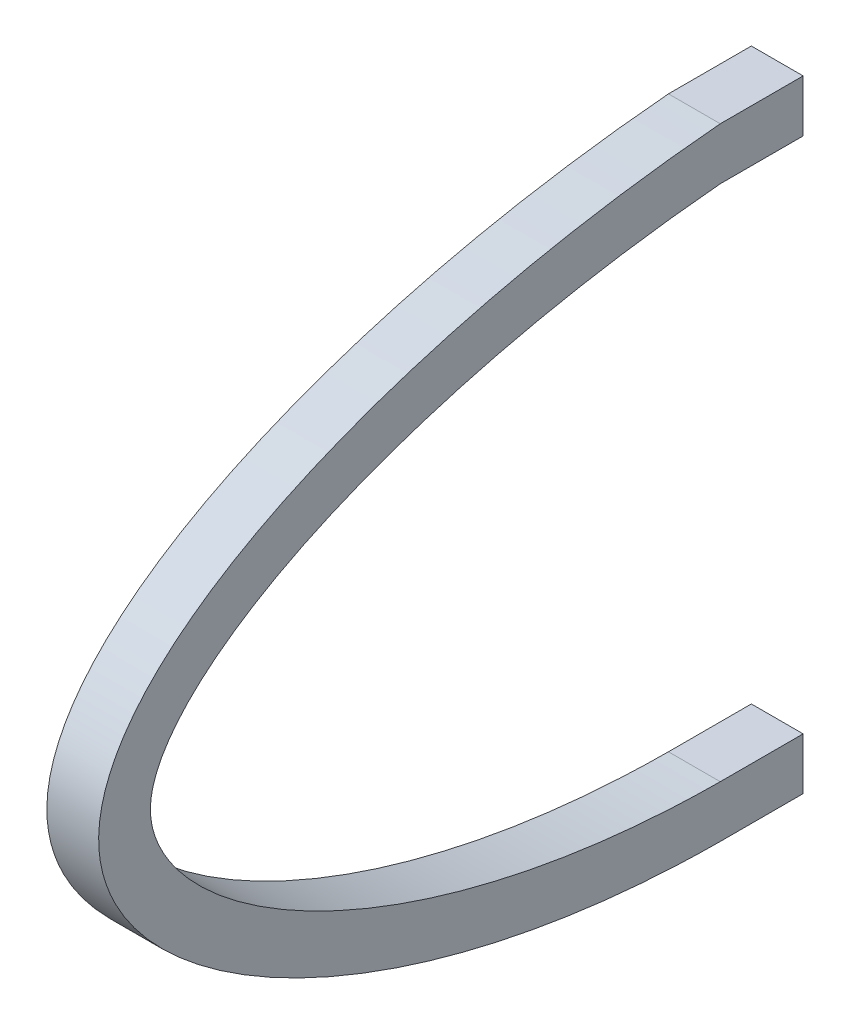
ISO-10303-21;
HEADER;
FILE_DESCRIPTION(('STEP AP214'),'2;1');
FILE_NAME('part.step','',(''),(''),'','','');
FILE_SCHEMA(('AUTOMOTIVE_DESIGN { 1 0 10303 214 1 1 1 1 }'));
ENDSEC;
DATA;
#1=APPLICATION_CONTEXT('core data for automotive mechanical design processes');
#2=APPLICATION_PROTOCOL_DEFINITION('international standard','automotive_design',2000,#1);
#3=PRODUCT_CONTEXT('',#1,'mechanical');
#4=PRODUCT('Part','Part','',(#3));
#5=PRODUCT_RELATED_PRODUCT_CATEGORY('part','',(#4));
#6=PRODUCT_DEFINITION_FORMATION('','',#4);
#7=PRODUCT_DEFINITION_CONTEXT('part definition',#1,'design');
#8=PRODUCT_DEFINITION('design','',#6,#7);
#9=PRODUCT_DEFINITION_SHAPE('','',#8);
#10=(LENGTH_UNIT() NAMED_UNIT(*) SI_UNIT(.MILLI.,.METRE.));
#11=(NAMED_UNIT(*) PLANE_ANGLE_UNIT() SI_UNIT($,.RADIAN.));
#12=(NAMED_UNIT(*) SI_UNIT($,.STERADIAN.) SOLID_ANGLE_UNIT());
#13=UNCERTAINTY_MEASURE_WITH_UNIT(LENGTH_MEASURE(1.E-05),#10,'distance_accuracy_value','');
#14=(GEOMETRIC_REPRESENTATION_CONTEXT(3) GLOBAL_UNCERTAINTY_ASSIGNED_CONTEXT((#13)) GLOBAL_UNIT_ASSIGNED_CONTEXT((#10,
#11,#12)) REPRESENTATION_CONTEXT('',''));
#15=CARTESIAN_POINT('',(0.,0.,0.));
#16=DIRECTION('',(0.,0.,1.));
#17=DIRECTION('',(1.,0.,0.));
#18=AXIS2_PLACEMENT_3D('',#15,#16,#17);
#19=CARTESIAN_POINT('',(2.5,25.0289491542641,-0.436628824984402));
#20=CARTESIAN_POINT('',(2.5,24.9395700058259,0.582975217120961));
#21=CARTESIAN_POINT('',(2.5,24.7401700683265,2.63045505060355));
#22=CARTESIAN_POINT('',(2.5,24.2711193834267,6.63746503717986));
#23=CARTESIAN_POINT('',(2.5,23.552462654983,11.5253834597104));
#24=CARTESIAN_POINT('',(2.5,22.4931304621103,17.1505259700721));
#25=CARTESIAN_POINT('',(2.5,20.8362155902983,24.295280126556));
#26=CARTESIAN_POINT('',(2.5,18.3430780360653,32.4795482876064));
#27=CARTESIAN_POINT('',(2.5,14.8061601457434,40.8506061792145));
#28=CARTESIAN_POINT('',(2.5,10.8932305459291,47.5011107796552));
#29=CARTESIAN_POINT('',(2.5,6.84602415373157,52.159077464287));
#30=CARTESIAN_POINT('',(2.5,3.7252925575514,54.2151887229658));
#31=CARTESIAN_POINT('',(2.5,1.5725893975115,54.9110090639514));
#32=CARTESIAN_POINT('',(2.5,0.096957705492859,55.0581045090311));
#33=CARTESIAN_POINT('',(2.5,-1.45615685938082,54.8607907140631));
#34=CARTESIAN_POINT('',(2.5,-3.83595966123072,54.0405785955811));
#35=CARTESIAN_POINT('',(2.5,-7.29991682469028,51.7657302320741));
#36=CARTESIAN_POINT('',(2.5,-11.7098894831255,46.9244741975008));
#37=CARTESIAN_POINT('',(2.5,-15.9144305174305,40.2077409332809));
#38=CARTESIAN_POINT('',(2.5,-19.6037231559487,31.8912051847254));
#39=CARTESIAN_POINT('',(2.5,-22.0398423531586,23.8584155214309));
#40=CARTESIAN_POINT('',(2.5,-23.4968241113966,16.9037726231752));
#41=CARTESIAN_POINT('',(2.5,-24.3181486771657,11.4570472951455));
#42=CARTESIAN_POINT('',(2.5,-24.7556535718619,6.74942214644306));
#43=CARTESIAN_POINT('',(2.5,-24.9453621982501,2.90512843317773));
#44=CARTESIAN_POINT('',(2.5,-24.9848703494899,0.947262235692928));
#45=CARTESIAN_POINT('',(2.5,-24.9902273107794,-0.0274784886774704));
#46=B_SPLINE_CURVE_WITH_KNOTS('',3,(#19,#20,#21,#22,#23,#24,#25,#26,#27,#28,#29,#30,#31,#32,#33,
#34,#35,#36,#37,#38,#39,#40,#41,#42,#43,#44,#45),.UNSPECIFIED.,.F.,.F.,(4,1,1,1,1,1,1,1,1,1,1,1,
1,1,1,1,1,1,1,1,1,1,1,1,4),(0.,0.015625,0.03125,0.0625,0.09375,0.125,0.1875,0.25,0.3125,0.375,
0.4375,0.46875,0.5,0.53125,0.5625,0.625,0.6875,0.75,0.8125,0.875,0.90625,0.9375,0.96875,
0.984375,1.),.UNSPECIFIED.);
#47=DIRECTION('',(-1.,0.,0.));
#48=VECTOR('',#47,1.);
#49=SURFACE_OF_LINEAR_EXTRUSION('',#46,#48);
#50=CARTESIAN_POINT('',(-2.5,25.0289491542641,-0.436628824984402));
#51=CARTESIAN_POINT('',(-2.5,24.9395700058259,0.582975217120961));
#52=CARTESIAN_POINT('',(-2.5,24.7401700683265,2.63045505060355));
#53=CARTESIAN_POINT('',(-2.5,24.2711193834267,6.63746503717986));
#54=CARTESIAN_POINT('',(-2.5,23.552462654983,11.5253834597104));
#55=CARTESIAN_POINT('',(-2.5,22.4931304621103,17.1505259700721));
#56=CARTESIAN_POINT('',(-2.5,20.8362155902983,24.295280126556));
#57=CARTESIAN_POINT('',(-2.5,18.3430780360653,32.4795482876064));
#58=CARTESIAN_POINT('',(-2.5,14.8061601457434,40.8506061792145));
#59=CARTESIAN_POINT('',(-2.5,10.8932305459291,47.5011107796552));
#60=CARTESIAN_POINT('',(-2.5,6.84602415373157,52.159077464287));
#61=CARTESIAN_POINT('',(-2.5,3.7252925575514,54.2151887229658));
#62=CARTESIAN_POINT('',(-2.5,1.5725893975115,54.9110090639514));
#63=CARTESIAN_POINT('',(-2.5,0.096957705492859,55.0581045090311));
#64=CARTESIAN_POINT('',(-2.5,-1.45615685938082,54.8607907140631));
#65=CARTESIAN_POINT('',(-2.5,-3.83595966123072,54.0405785955811));
#66=CARTESIAN_POINT('',(-2.5,-7.29991682469028,51.7657302320741));
#67=CARTESIAN_POINT('',(-2.5,-11.7098894831255,46.9244741975008));
#68=CARTESIAN_POINT('',(-2.5,-15.9144305174305,40.2077409332809));
#69=CARTESIAN_POINT('',(-2.5,-19.6037231559487,31.8912051847254));
#70=CARTESIAN_POINT('',(-2.5,-22.0398423531586,23.8584155214309));
#71=CARTESIAN_POINT('',(-2.5,-23.4968241113966,16.9037726231752));
#72=CARTESIAN_POINT('',(-2.5,-24.3181486771657,11.4570472951455));
#73=CARTESIAN_POINT('',(-2.5,-24.7556535718619,6.74942214644306));
#74=CARTESIAN_POINT('',(-2.5,-24.9453621982501,2.90512843317773));
#75=CARTESIAN_POINT('',(-2.5,-24.9848703494899,0.947262235692928));
#76=CARTESIAN_POINT('',(-2.5,-24.9902273107794,-0.0274784886774704));
#77=B_SPLINE_CURVE_WITH_KNOTS('',3,(#50,#51,#52,#53,#54,#55,#56,#57,#58,#59,#60,#61,#62,#63,#64,
#65,#66,#67,#68,#69,#70,#71,#72,#73,#74,#75,#76),.UNSPECIFIED.,.F.,.F.,(4,1,1,1,1,1,1,1,1,1,1,1,
1,1,1,1,1,1,1,1,1,1,1,1,4),(0.,0.015625,0.03125,0.0625,0.09375,0.125,0.1875,0.25,0.3125,0.375,
0.4375,0.46875,0.5,0.53125,0.5625,0.625,0.6875,0.75,0.8125,0.875,0.90625,0.9375,0.96875,
0.984375,1.),.UNSPECIFIED.);
#78=CARTESIAN_POINT('',(-2.5,24.9900725317667,0.));
#79=VERTEX_POINT('',#78);
#80=CARTESIAN_POINT('',(-2.5,-24.9900725317667,0.));
#81=VERTEX_POINT('',#80);
#82=EDGE_CURVE('E140',#79,#81,#77,.T.);
#83=ORIENTED_EDGE('',*,*,#82,.F.);
#84=DIRECTION('',(-1.,0.,0.));
#85=VECTOR('',#84,1.);
#86=CARTESIAN_POINT('',(2.5,24.9900725317667,0.));
#87=LINE('',#86,#85);
#88=CARTESIAN_POINT('',(2.5,24.9900725317667,0.));
#89=VERTEX_POINT('',#88);
#90=EDGE_CURVE('E11',#89,#79,#87,.T.);
#91=ORIENTED_EDGE('',*,*,#90,.F.);
#92=CARTESIAN_POINT('',(2.5,-24.9900725317667,0.));
#93=VERTEX_POINT('',#92);
#94=EDGE_CURVE('E175',#89,#93,#46,.T.);
#95=ORIENTED_EDGE('',*,*,#94,.T.);
#96=DIRECTION('',(-1.,0.,0.));
#97=VECTOR('',#96,1.);
#98=CARTESIAN_POINT('',(2.5,-24.9900725317667,0.));
#99=LINE('',#98,#97);
#100=EDGE_CURVE('E57',#93,#81,#99,.T.);
#101=ORIENTED_EDGE('',*,*,#100,.T.);
#102=EDGE_LOOP('',(#83,#91,#95,#101));
#103=FACE_BOUND('',#102,.T.);
#104=ADVANCED_FACE('F39',(#103),#49,.T.);
#105=CARTESIAN_POINT('',(2.5,24.9900725317667,0.));
#106=DIRECTION('',(0.,-1.,0.));
#107=DIRECTION('',(0.,0.,-1.));
#108=AXIS2_PLACEMENT_3D('',#105,#106,#107);
#109=PLANE('',#108);
#110=DIRECTION('',(0.,0.,1.));
#111=VECTOR('',#110,1.);
#112=CARTESIAN_POINT('',(-2.5,24.9900725317667,0.));
#113=LINE('',#112,#111);
#114=CARTESIAN_POINT('',(-2.5,24.9900725317667,-8.));
#115=VERTEX_POINT('',#114);
#116=EDGE_CURVE('E145',#115,#79,#113,.T.);
#117=ORIENTED_EDGE('',*,*,#116,.F.);
#118=DIRECTION('',(-1.,0.,0.));
#119=VECTOR('',#118,1.);
#120=CARTESIAN_POINT('',(2.5,24.9900725317667,-8.));
#121=LINE('',#120,#119);
#122=CARTESIAN_POINT('',(2.5,24.9900725317667,-8.));
#123=VERTEX_POINT('',#122);
#124=EDGE_CURVE('E49',#123,#115,#121,.T.);
#125=ORIENTED_EDGE('',*,*,#124,.F.);
#126=DIRECTION('',(0.,0.,1.));
#127=VECTOR('',#126,1.);
#128=CARTESIAN_POINT('',(2.5,24.9900725317667,0.));
#129=LINE('',#128,#127);
#130=EDGE_CURVE('E204',#123,#89,#129,.T.);
#131=ORIENTED_EDGE('',*,*,#130,.T.);
#132=ORIENTED_EDGE('',*,*,#90,.T.);
#133=EDGE_LOOP('',(#117,#125,#131,#132));
#134=FACE_BOUND('',#133,.T.);
#135=ADVANCED_FACE('F195',(#134),#109,.T.);
#136=CARTESIAN_POINT('',(2.5,0.,-8.));
#137=DIRECTION('',(0.,0.,-1.));
#138=DIRECTION('',(-1.,0.,0.));
#139=AXIS2_PLACEMENT_3D('',#136,#137,#138);
#140=PLANE('',#139);
#141=DIRECTION('',(0.,-1.,0.));
#142=VECTOR('',#141,1.);
#143=CARTESIAN_POINT('',(-2.5,0.,-8.));
#144=LINE('',#143,#142);
#145=CARTESIAN_POINT('',(-2.5,30.0098481965247,-8.));
#146=VERTEX_POINT('',#145);
#147=EDGE_CURVE('E152',#146,#115,#144,.T.);
#148=ORIENTED_EDGE('',*,*,#147,.F.);
#149=DIRECTION('',(-1.,0.,0.));
#150=VECTOR('',#149,1.);
#151=CARTESIAN_POINT('',(2.5,30.0098481965247,-8.));
#152=LINE('',#151,#150);
#153=CARTESIAN_POINT('',(2.5,30.0098481965247,-8.));
#154=VERTEX_POINT('',#153);
#155=EDGE_CURVE('E182',#154,#146,#152,.T.);
#156=ORIENTED_EDGE('',*,*,#155,.F.);
#157=DIRECTION('',(0.,-1.,0.));
#158=VECTOR('',#157,1.);
#159=CARTESIAN_POINT('',(2.5,0.,-8.));
#160=LINE('',#159,#158);
#161=EDGE_CURVE('E191',#154,#123,#160,.T.);
#162=ORIENTED_EDGE('',*,*,#161,.T.);
#163=ORIENTED_EDGE('',*,*,#124,.T.);
#164=EDGE_LOOP('',(#148,#156,#162,#163));
#165=FACE_BOUND('',#164,.T.);
#166=ADVANCED_FACE('F189',(#165),#140,.T.);
#167=CARTESIAN_POINT('',(2.5,30.0098481965247,0.));
#168=DIRECTION('',(0.,1.,0.));
#169=DIRECTION('',(0.,0.,1.));
#170=AXIS2_PLACEMENT_3D('',#167,#168,#169);
#171=PLANE('',#170);
#172=DIRECTION('',(0.,0.,-1.));
#173=VECTOR('',#172,1.);
#174=CARTESIAN_POINT('',(-2.5,30.0098481965247,0.));
#175=LINE('',#174,#173);
#176=CARTESIAN_POINT('',(-2.5,30.0098481965247,0.));
#177=VERTEX_POINT('',#176);
#178=EDGE_CURVE('E156',#177,#146,#175,.T.);
#179=ORIENTED_EDGE('',*,*,#178,.F.);
#180=DIRECTION('',(-1.,0.,0.));
#181=VECTOR('',#180,1.);
#182=CARTESIAN_POINT('',(2.5,30.0098481965247,0.));
#183=LINE('',#182,#181);
#184=CARTESIAN_POINT('',(2.5,30.0098481965247,0.));
#185=VERTEX_POINT('',#184);
#186=EDGE_CURVE('E179',#185,#177,#183,.T.);
#187=ORIENTED_EDGE('',*,*,#186,.F.);
#188=DIRECTION('',(0.,0.,-1.));
#189=VECTOR('',#188,1.);
#190=CARTESIAN_POINT('',(2.5,30.0098481965247,0.));
#191=LINE('',#190,#189);
#192=EDGE_CURVE('E203',#185,#154,#191,.T.);
#193=ORIENTED_EDGE('',*,*,#192,.T.);
#194=ORIENTED_EDGE('',*,*,#155,.T.);
#195=EDGE_LOOP('',(#179,#187,#193,#194));
#196=FACE_BOUND('',#195,.T.);
#197=ADVANCED_FACE('F201',(#196),#171,.T.);
#198=CARTESIAN_POINT('',(2.5,30.0098481965247,0.));
#199=CARTESIAN_POINT('',(2.5,27.0411509890906,33.8657922499705));
#200=CARTESIAN_POINT('',(2.5,1.38801597270597,86.5989070347746));
#201=CARTESIAN_POINT('',(2.5,-29.8091399448759,32.9365139365134));
#202=CARTESIAN_POINT('',(2.5,-29.9901518034753,0.));
#203=B_SPLINE_CURVE_WITH_KNOTS('',3,(#198,#199,#200,#201,#202),.UNSPECIFIED.,.F.,.F.,(4,1,4),
(0.,0.500032233041723,1.),.UNSPECIFIED.);
#204=DIRECTION('',(-1.,0.,0.));
#205=VECTOR('',#204,1.);
#206=SURFACE_OF_LINEAR_EXTRUSION('',#203,#205);
#207=CARTESIAN_POINT('',(-2.5,30.0098481965247,0.));
#208=CARTESIAN_POINT('',(-2.5,27.0411509890906,33.8657922499705));
#209=CARTESIAN_POINT('',(-2.5,1.38801597270597,86.5989070347746));
#210=CARTESIAN_POINT('',(-2.5,-29.8091399448759,32.9365139365134));
#211=CARTESIAN_POINT('',(-2.5,-29.9901518034753,0.));
#212=B_SPLINE_CURVE_WITH_KNOTS('',3,(#207,#208,#209,#210,#211),.UNSPECIFIED.,.F.,.F.,(4,1,4),
(0.,0.500032233041723,1.),.UNSPECIFIED.);
#213=CARTESIAN_POINT('',(-2.5,-29.9901518034753,0.));
#214=VERTEX_POINT('',#213);
#215=EDGE_CURVE('E160',#177,#214,#212,.T.);
#216=ORIENTED_EDGE('',*,*,#215,.T.);
#217=DIRECTION('',(-1.,0.,0.));
#218=VECTOR('',#217,1.);
#219=CARTESIAN_POINT('',(2.5,-29.9901518034753,0.));
#220=LINE('',#219,#218);
#221=CARTESIAN_POINT('',(2.5,-29.9901518034753,0.));
#222=VERTEX_POINT('',#221);
#223=EDGE_CURVE('E122',#222,#214,#220,.T.);
#224=ORIENTED_EDGE('',*,*,#223,.F.);
#225=EDGE_CURVE('E131',#185,#222,#203,.T.);
#226=ORIENTED_EDGE('',*,*,#225,.F.);
#227=ORIENTED_EDGE('',*,*,#186,.T.);
#228=EDGE_LOOP('',(#216,#224,#226,#227));
#229=FACE_BOUND('',#228,.T.);
#230=ADVANCED_FACE('F218',(#229),#206,.F.);
#231=CARTESIAN_POINT('',(2.5,-29.9901518034753,0.));
#232=DIRECTION('',(0.,-1.,0.));
#233=DIRECTION('',(0.,0.,-1.));
#234=AXIS2_PLACEMENT_3D('',#231,#232,#233);
#235=PLANE('',#234);
#236=DIRECTION('',(0.,0.,1.));
#237=VECTOR('',#236,1.);
#238=CARTESIAN_POINT('',(-2.5,-29.9901518034753,0.));
#239=LINE('',#238,#237);
#240=CARTESIAN_POINT('',(-2.5,-29.9901518034753,-8.));
#241=VERTEX_POINT('',#240);
#242=EDGE_CURVE('E118',#241,#214,#239,.T.);
#243=ORIENTED_EDGE('',*,*,#242,.F.);
#244=DIRECTION('',(-1.,0.,0.));
#245=VECTOR('',#244,1.);
#246=CARTESIAN_POINT('',(2.5,-29.9901518034753,-8.));
#247=LINE('',#246,#245);
#248=CARTESIAN_POINT('',(2.5,-29.9901518034753,-8.));
#249=VERTEX_POINT('',#248);
#250=EDGE_CURVE('E113',#249,#241,#247,.T.);
#251=ORIENTED_EDGE('',*,*,#250,.F.);
#252=DIRECTION('',(0.,0.,1.));
#253=VECTOR('',#252,1.);
#254=CARTESIAN_POINT('',(2.5,-29.9901518034753,0.));
#255=LINE('',#254,#253);
#256=EDGE_CURVE('E116',#249,#222,#255,.T.);
#257=ORIENTED_EDGE('',*,*,#256,.T.);
#258=ORIENTED_EDGE('',*,*,#223,.T.);
#259=EDGE_LOOP('',(#243,#251,#257,#258));
#260=FACE_BOUND('',#259,.T.);
#261=ADVANCED_FACE('F115',(#260),#235,.T.);
#262=CARTESIAN_POINT('',(2.5,0.,-8.));
#263=DIRECTION('',(0.,0.,-1.));
#264=DIRECTION('',(-1.,0.,0.));
#265=AXIS2_PLACEMENT_3D('',#262,#263,#264);
#266=PLANE('',#265);
#267=DIRECTION('',(0.,-1.,0.));
#268=VECTOR('',#267,1.);
#269=CARTESIAN_POINT('',(-2.5,0.,-8.));
#270=LINE('',#269,#268);
#271=CARTESIAN_POINT('',(-2.5,-24.9900725317667,-8.));
#272=VERTEX_POINT('',#271);
#273=EDGE_CURVE('E170',#272,#241,#270,.T.);
#274=ORIENTED_EDGE('',*,*,#273,.F.);
#275=DIRECTION('',(-1.,0.,0.));
#276=VECTOR('',#275,1.);
#277=CARTESIAN_POINT('',(2.5,-24.9900725317667,-8.));
#278=LINE('',#277,#276);
#279=CARTESIAN_POINT('',(2.5,-24.9900725317667,-8.));
#280=VERTEX_POINT('',#279);
#281=EDGE_CURVE('E86',#280,#272,#278,.T.);
#282=ORIENTED_EDGE('',*,*,#281,.F.);
#283=DIRECTION('',(0.,-1.,0.));
#284=VECTOR('',#283,1.);
#285=CARTESIAN_POINT('',(2.5,0.,-8.));
#286=LINE('',#285,#284);
#287=EDGE_CURVE('E128',#280,#249,#286,.T.);
#288=ORIENTED_EDGE('',*,*,#287,.T.);
#289=ORIENTED_EDGE('',*,*,#250,.T.);
#290=EDGE_LOOP('',(#274,#282,#288,#289));
#291=FACE_BOUND('',#290,.T.);
#292=ADVANCED_FACE('F134',(#291),#266,.T.);
#293=CARTESIAN_POINT('',(2.5,-24.9900725317667,0.));
#294=DIRECTION('',(0.,1.,0.));
#295=DIRECTION('',(0.,0.,1.));
#296=AXIS2_PLACEMENT_3D('',#293,#294,#295);
#297=PLANE('',#296);
#298=DIRECTION('',(0.,0.,-1.));
#299=VECTOR('',#298,1.);
#300=CARTESIAN_POINT('',(-2.5,-24.9900725317667,0.));
#301=LINE('',#300,#299);
#302=EDGE_CURVE('E172',#81,#272,#301,.T.);
#303=ORIENTED_EDGE('',*,*,#302,.F.);
#304=ORIENTED_EDGE('',*,*,#100,.F.);
#305=DIRECTION('',(0.,0.,-1.));
#306=VECTOR('',#305,1.);
#307=CARTESIAN_POINT('',(2.5,-24.9900725317667,0.));
#308=LINE('',#307,#306);
#309=EDGE_CURVE('E135',#93,#280,#308,.T.);
#310=ORIENTED_EDGE('',*,*,#309,.T.);
#311=ORIENTED_EDGE('',*,*,#281,.T.);
#312=EDGE_LOOP('',(#303,#304,#310,#311));
#313=FACE_BOUND('',#312,.T.);
#314=ADVANCED_FACE('F233',(#313),#297,.T.);
#315=CARTESIAN_POINT('',(2.5,0.,0.));
#316=DIRECTION('',(1.,0.,0.));
#317=DIRECTION('',(0.,0.,-1.));
#318=AXIS2_PLACEMENT_3D('',#315,#316,#317);
#319=PLANE('',#318);
#320=ORIENTED_EDGE('',*,*,#94,.F.);
#321=ORIENTED_EDGE('',*,*,#130,.F.);
#322=ORIENTED_EDGE('',*,*,#161,.F.);
#323=ORIENTED_EDGE('',*,*,#192,.F.);
#324=ORIENTED_EDGE('',*,*,#225,.T.);
#325=ORIENTED_EDGE('',*,*,#256,.F.);
#326=ORIENTED_EDGE('',*,*,#287,.F.);
#327=ORIENTED_EDGE('',*,*,#309,.F.);
#328=EDGE_LOOP('',(#320,#321,#322,#323,#324,#325,#326,#327));
#329=FACE_BOUND('',#328,.T.);
#330=ADVANCED_FACE('F126',(#329),#319,.T.);
#331=CARTESIAN_POINT('',(-2.5,0.,0.));
#332=DIRECTION('',(1.,0.,0.));
#333=DIRECTION('',(0.,0.,-1.));
#334=AXIS2_PLACEMENT_3D('',#331,#332,#333);
#335=PLANE('',#334);
#336=ORIENTED_EDGE('',*,*,#82,.T.);
#337=ORIENTED_EDGE('',*,*,#302,.T.);
#338=ORIENTED_EDGE('',*,*,#273,.T.);
#339=ORIENTED_EDGE('',*,*,#242,.T.);
#340=ORIENTED_EDGE('',*,*,#215,.F.);
#341=ORIENTED_EDGE('',*,*,#178,.T.);
#342=ORIENTED_EDGE('',*,*,#147,.T.);
#343=ORIENTED_EDGE('',*,*,#116,.T.);
#344=EDGE_LOOP('',(#336,#337,#338,#339,#340,#341,#342,#343));
#345=FACE_BOUND('',#344,.T.);
#346=ADVANCED_FACE('F197',(#345),#335,.F.);
#347=CLOSED_SHELL('',(#104,#135,#166,#197,#230,#261,#292,#314,#330,#346));
#348=MANIFOLD_SOLID_BREP('B2',#347);
#349=ADVANCED_BREP_SHAPE_REPRESENTATION('',(#18,#348),#14);
#350=SHAPE_DEFINITION_REPRESENTATION(#9,#349);
ENDSEC;
END-ISO-10303-21;
